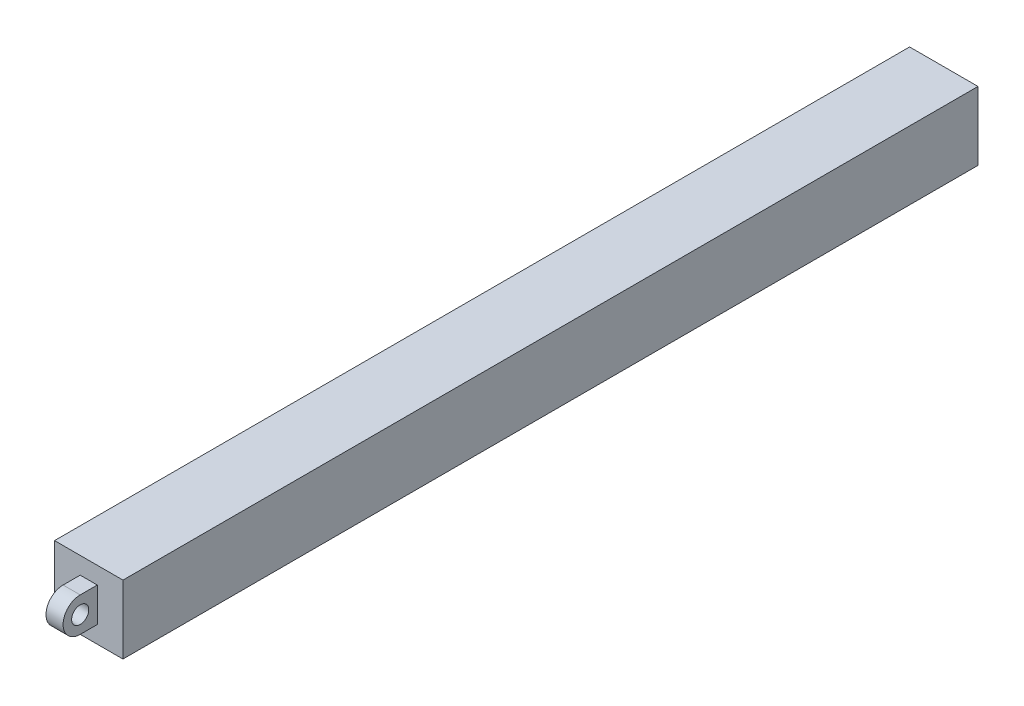
ISO-10303-21;
HEADER;
FILE_DESCRIPTION(('STEP AP214'),'2;1');
FILE_NAME('part.step','',(''),(''),'','','');
FILE_SCHEMA(('AUTOMOTIVE_DESIGN { 1 0 10303 214 1 1 1 1 }'));
ENDSEC;
DATA;
#1=APPLICATION_CONTEXT('core data for automotive mechanical design processes');
#2=APPLICATION_PROTOCOL_DEFINITION('international standard','automotive_design',2000,#1);
#3=PRODUCT_CONTEXT('',#1,'mechanical');
#4=PRODUCT('Part','Part','',(#3));
#5=PRODUCT_RELATED_PRODUCT_CATEGORY('part','',(#4));
#6=PRODUCT_DEFINITION_FORMATION('','',#4);
#7=PRODUCT_DEFINITION_CONTEXT('part definition',#1,'design');
#8=PRODUCT_DEFINITION('design','',#6,#7);
#9=PRODUCT_DEFINITION_SHAPE('','',#8);
#10=(LENGTH_UNIT() NAMED_UNIT(*) SI_UNIT(.MILLI.,.METRE.));
#11=(NAMED_UNIT(*) PLANE_ANGLE_UNIT() SI_UNIT($,.RADIAN.));
#12=(NAMED_UNIT(*) SI_UNIT($,.STERADIAN.) SOLID_ANGLE_UNIT());
#13=UNCERTAINTY_MEASURE_WITH_UNIT(LENGTH_MEASURE(1.E-05),#10,'distance_accuracy_value','');
#14=(GEOMETRIC_REPRESENTATION_CONTEXT(3) GLOBAL_UNCERTAINTY_ASSIGNED_CONTEXT((#13)) GLOBAL_UNIT_ASSIGNED_CONTEXT((#10,
#11,#12)) REPRESENTATION_CONTEXT('',''));
#15=CARTESIAN_POINT('',(0.,0.,0.));
#16=DIRECTION('',(0.,0.,1.));
#17=DIRECTION('',(1.,0.,0.));
#18=AXIS2_PLACEMENT_3D('',#15,#16,#17);
#19=CARTESIAN_POINT('',(5.,5.,62.5));
#20=DIRECTION('',(0.,0.,-1.));
#21=DIRECTION('',(-1.,0.,0.));
#22=AXIS2_PLACEMENT_3D('',#19,#20,#21);
#23=PLANE('',#22);
#24=DIRECTION('',(0.,-1.,0.));
#25=VECTOR('',#24,1.);
#26=CARTESIAN_POINT('',(-5.,5.,62.5));
#27=LINE('',#26,#25);
#28=CARTESIAN_POINT('',(-5.,5.,62.5));
#29=VERTEX_POINT('',#28);
#30=CARTESIAN_POINT('',(-5.,-5.,62.5));
#31=VERTEX_POINT('',#30);
#32=EDGE_CURVE('E117',#29,#31,#27,.T.);
#33=ORIENTED_EDGE('',*,*,#32,.T.);
#34=DIRECTION('',(-1.,0.,0.));
#35=VECTOR('',#34,1.);
#36=CARTESIAN_POINT('',(5.,-5.,62.5));
#37=LINE('',#36,#35);
#38=CARTESIAN_POINT('',(5.,-5.,62.5));
#39=VERTEX_POINT('',#38);
#40=EDGE_CURVE('E11',#39,#31,#37,.T.);
#41=ORIENTED_EDGE('',*,*,#40,.F.);
#42=DIRECTION('',(0.,-1.,0.));
#43=VECTOR('',#42,1.);
#44=CARTESIAN_POINT('',(5.,5.,62.5));
#45=LINE('',#44,#43);
#46=CARTESIAN_POINT('',(5.,5.,62.5));
#47=VERTEX_POINT('',#46);
#48=EDGE_CURVE('E126',#47,#39,#45,.T.);
#49=ORIENTED_EDGE('',*,*,#48,.F.);
#50=DIRECTION('',(-1.,0.,0.));
#51=VECTOR('',#50,1.);
#52=CARTESIAN_POINT('',(5.,5.,62.5));
#53=LINE('',#52,#51);
#54=EDGE_CURVE('E135',#47,#29,#53,.T.);
#55=ORIENTED_EDGE('',*,*,#54,.T.);
#56=EDGE_LOOP('',(#33,#41,#49,#55));
#57=FACE_BOUND('',#56,.T.);
#58=DIRECTION('',(-1.,0.,0.));
#59=VECTOR('',#58,1.);
#60=CARTESIAN_POINT('',(1.25,-2.5,62.5));
#61=LINE('',#60,#59);
#62=CARTESIAN_POINT('',(1.25,-2.5,62.5));
#63=VERTEX_POINT('',#62);
#64=CARTESIAN_POINT('',(-1.25,-2.5,62.5));
#65=VERTEX_POINT('',#64);
#66=EDGE_CURVE('E52',#63,#65,#61,.T.);
#67=ORIENTED_EDGE('',*,*,#66,.T.);
#68=DIRECTION('',(0.,1.,0.));
#69=VECTOR('',#68,1.);
#70=CARTESIAN_POINT('',(-1.25,2.5,62.5));
#71=LINE('',#70,#69);
#72=CARTESIAN_POINT('',(-1.25,2.5,62.5));
#73=VERTEX_POINT('',#72);
#74=EDGE_CURVE('E216',#65,#73,#71,.T.);
#75=ORIENTED_EDGE('',*,*,#74,.T.);
#76=DIRECTION('',(-1.,0.,0.));
#77=VECTOR('',#76,1.);
#78=CARTESIAN_POINT('',(1.25,2.5,62.5));
#79=LINE('',#78,#77);
#80=CARTESIAN_POINT('',(1.25,2.5,62.5));
#81=VERTEX_POINT('',#80);
#82=EDGE_CURVE('E122',#81,#73,#79,.T.);
#83=ORIENTED_EDGE('',*,*,#82,.F.);
#84=DIRECTION('',(0.,1.,0.));
#85=VECTOR('',#84,1.);
#86=CARTESIAN_POINT('',(1.25,2.5,62.5));
#87=LINE('',#86,#85);
#88=EDGE_CURVE('E47',#63,#81,#87,.T.);
#89=ORIENTED_EDGE('',*,*,#88,.F.);
#90=EDGE_LOOP('',(#67,#75,#83,#89));
#91=FACE_BOUND('',#90,.T.);
#92=ADVANCED_FACE('F33',(#57,#91),#23,.F.);
#93=CARTESIAN_POINT('',(5.,-5.,62.5));
#94=DIRECTION('',(0.,1.,0.));
#95=DIRECTION('',(0.,0.,1.));
#96=AXIS2_PLACEMENT_3D('',#93,#94,#95);
#97=PLANE('',#96);
#98=DIRECTION('',(0.,0.,-1.));
#99=VECTOR('',#98,1.);
#100=CARTESIAN_POINT('',(-5.,-5.,62.5));
#101=LINE('',#100,#99);
#102=CARTESIAN_POINT('',(-5.,-5.,-62.5));
#103=VERTEX_POINT('',#102);
#104=EDGE_CURVE('E120',#31,#103,#101,.T.);
#105=ORIENTED_EDGE('',*,*,#104,.T.);
#106=DIRECTION('',(-1.,0.,0.));
#107=VECTOR('',#106,1.);
#108=CARTESIAN_POINT('',(5.,-5.,-62.5));
#109=LINE('',#108,#107);
#110=CARTESIAN_POINT('',(5.,-5.,-62.5));
#111=VERTEX_POINT('',#110);
#112=EDGE_CURVE('E40',#111,#103,#109,.T.);
#113=ORIENTED_EDGE('',*,*,#112,.F.);
#114=DIRECTION('',(0.,0.,-1.));
#115=VECTOR('',#114,1.);
#116=CARTESIAN_POINT('',(5.,-5.,62.5));
#117=LINE('',#116,#115);
#118=EDGE_CURVE('E129',#39,#111,#117,.T.);
#119=ORIENTED_EDGE('',*,*,#118,.F.);
#120=ORIENTED_EDGE('',*,*,#40,.T.);
#121=EDGE_LOOP('',(#105,#113,#119,#120));
#122=FACE_BOUND('',#121,.T.);
#123=ADVANCED_FACE('F166',(#122),#97,.F.);
#124=CARTESIAN_POINT('',(5.,5.,-62.5));
#125=DIRECTION('',(0.,0.,1.));
#126=DIRECTION('',(1.,0.,0.));
#127=AXIS2_PLACEMENT_3D('',#124,#125,#126);
#128=PLANE('',#127);
#129=DIRECTION('',(0.,1.,0.));
#130=VECTOR('',#129,1.);
#131=CARTESIAN_POINT('',(-5.,5.,-62.5));
#132=LINE('',#131,#130);
#133=CARTESIAN_POINT('',(-5.,5.,-62.5));
#134=VERTEX_POINT('',#133);
#135=EDGE_CURVE('E138',#103,#134,#132,.T.);
#136=ORIENTED_EDGE('',*,*,#135,.T.);
#137=DIRECTION('',(-1.,0.,0.));
#138=VECTOR('',#137,1.);
#139=CARTESIAN_POINT('',(5.,5.,-62.5));
#140=LINE('',#139,#138);
#141=CARTESIAN_POINT('',(5.,5.,-62.5));
#142=VERTEX_POINT('',#141);
#143=EDGE_CURVE('E143',#142,#134,#140,.T.);
#144=ORIENTED_EDGE('',*,*,#143,.F.);
#145=DIRECTION('',(0.,1.,0.));
#146=VECTOR('',#145,1.);
#147=CARTESIAN_POINT('',(5.,5.,-62.5));
#148=LINE('',#147,#146);
#149=EDGE_CURVE('E132',#111,#142,#148,.T.);
#150=ORIENTED_EDGE('',*,*,#149,.F.);
#151=ORIENTED_EDGE('',*,*,#112,.T.);
#152=EDGE_LOOP('',(#136,#144,#150,#151));
#153=FACE_BOUND('',#152,.T.);
#154=ADVANCED_FACE('F150',(#153),#128,.F.);
#155=CARTESIAN_POINT('',(5.,5.,62.5));
#156=DIRECTION('',(0.,-1.,0.));
#157=DIRECTION('',(0.,0.,-1.));
#158=AXIS2_PLACEMENT_3D('',#155,#156,#157);
#159=PLANE('',#158);
#160=DIRECTION('',(0.,0.,1.));
#161=VECTOR('',#160,1.);
#162=CARTESIAN_POINT('',(-5.,5.,62.5));
#163=LINE('',#162,#161);
#164=EDGE_CURVE('E130',#134,#29,#163,.T.);
#165=ORIENTED_EDGE('',*,*,#164,.T.);
#166=ORIENTED_EDGE('',*,*,#54,.F.);
#167=DIRECTION('',(0.,0.,1.));
#168=VECTOR('',#167,1.);
#169=CARTESIAN_POINT('',(5.,5.,62.5));
#170=LINE('',#169,#168);
#171=EDGE_CURVE('E134',#142,#47,#170,.T.);
#172=ORIENTED_EDGE('',*,*,#171,.F.);
#173=ORIENTED_EDGE('',*,*,#143,.T.);
#174=EDGE_LOOP('',(#165,#166,#172,#173));
#175=FACE_BOUND('',#174,.T.);
#176=ADVANCED_FACE('F159',(#175),#159,.F.);
#177=CARTESIAN_POINT('',(5.,0.,0.));
#178=DIRECTION('',(1.,0.,0.));
#179=DIRECTION('',(0.,0.,-1.));
#180=AXIS2_PLACEMENT_3D('',#177,#178,#179);
#181=PLANE('',#180);
#182=ORIENTED_EDGE('',*,*,#48,.T.);
#183=ORIENTED_EDGE('',*,*,#118,.T.);
#184=ORIENTED_EDGE('',*,*,#149,.T.);
#185=ORIENTED_EDGE('',*,*,#171,.T.);
#186=EDGE_LOOP('',(#182,#183,#184,#185));
#187=FACE_BOUND('',#186,.T.);
#188=ADVANCED_FACE('F165',(#187),#181,.T.);
#189=CARTESIAN_POINT('',(-5.,0.,0.));
#190=DIRECTION('',(1.,0.,0.));
#191=DIRECTION('',(0.,0.,-1.));
#192=AXIS2_PLACEMENT_3D('',#189,#190,#191);
#193=PLANE('',#192);
#194=ORIENTED_EDGE('',*,*,#32,.F.);
#195=ORIENTED_EDGE('',*,*,#164,.F.);
#196=ORIENTED_EDGE('',*,*,#135,.F.);
#197=ORIENTED_EDGE('',*,*,#104,.F.);
#198=EDGE_LOOP('',(#194,#195,#196,#197));
#199=FACE_BOUND('',#198,.T.);
#200=ADVANCED_FACE('F156',(#199),#193,.F.);
#201=CARTESIAN_POINT('',(1.25,0.,65.));
#202=DIRECTION('',(1.,0.,0.));
#203=DIRECTION('',(0.,0.,-1.));
#204=AXIS2_PLACEMENT_3D('',#201,#202,#203);
#205=PLANE('',#204);
#206=CARTESIAN_POINT('',(1.25,0.,65.));
#207=DIRECTION('',(1.,0.,0.));
#208=DIRECTION('',(0.,0.,-1.));
#209=AXIS2_PLACEMENT_3D('',#206,#207,#208);
#210=CIRCLE('',#209,2.5);
#211=CARTESIAN_POINT('',(1.25,2.5,65.));
#212=VERTEX_POINT('',#211);
#213=CARTESIAN_POINT('',(1.25,-2.5,65.));
#214=VERTEX_POINT('',#213);
#215=EDGE_CURVE('E102',#212,#214,#210,.T.);
#216=ORIENTED_EDGE('',*,*,#215,.T.);
#217=DIRECTION('',(0.,0.,-1.));
#218=VECTOR('',#217,1.);
#219=CARTESIAN_POINT('',(1.25,-2.5,65.));
#220=LINE('',#219,#218);
#221=EDGE_CURVE('E95',#214,#63,#220,.T.);
#222=ORIENTED_EDGE('',*,*,#221,.T.);
#223=ORIENTED_EDGE('',*,*,#88,.T.);
#224=DIRECTION('',(0.,0.,1.));
#225=VECTOR('',#224,1.);
#226=CARTESIAN_POINT('',(1.25,2.5,65.));
#227=LINE('',#226,#225);
#228=EDGE_CURVE('E108',#81,#212,#227,.T.);
#229=ORIENTED_EDGE('',*,*,#228,.T.);
#230=EDGE_LOOP('',(#216,#222,#223,#229));
#231=FACE_BOUND('',#230,.T.);
#232=CARTESIAN_POINT('',(1.25,0.,65.));
#233=DIRECTION('',(1.,0.,0.));
#234=DIRECTION('',(0.,0.,-1.));
#235=AXIS2_PLACEMENT_3D('',#232,#233,#234);
#236=CIRCLE('',#235,1.25);
#237=CARTESIAN_POINT('',(1.25,0.,63.75));
#238=VERTEX_POINT('',#237);
#239=EDGE_CURVE('E202',#238,#238,#236,.T.);
#240=ORIENTED_EDGE('',*,*,#239,.F.);
#241=EDGE_LOOP('',(#240));
#242=FACE_BOUND('',#241,.T.);
#243=ADVANCED_FACE('F105',(#231,#242),#205,.T.);
#244=CARTESIAN_POINT('',(-1.25,0.,65.));
#245=DIRECTION('',(1.,0.,0.));
#246=DIRECTION('',(0.,0.,-1.));
#247=AXIS2_PLACEMENT_3D('',#244,#245,#246);
#248=PLANE('',#247);
#249=CARTESIAN_POINT('',(-1.25,0.,65.));
#250=DIRECTION('',(1.,0.,0.));
#251=DIRECTION('',(0.,0.,-1.));
#252=AXIS2_PLACEMENT_3D('',#249,#250,#251);
#253=CIRCLE('',#252,2.5);
#254=CARTESIAN_POINT('',(-1.25,2.5,65.));
#255=VERTEX_POINT('',#254);
#256=CARTESIAN_POINT('',(-1.25,-2.5,65.));
#257=VERTEX_POINT('',#256);
#258=EDGE_CURVE('E116',#255,#257,#253,.T.);
#259=ORIENTED_EDGE('',*,*,#258,.F.);
#260=DIRECTION('',(0.,0.,1.));
#261=VECTOR('',#260,1.);
#262=CARTESIAN_POINT('',(-1.25,2.5,65.));
#263=LINE('',#262,#261);
#264=EDGE_CURVE('E112',#73,#255,#263,.T.);
#265=ORIENTED_EDGE('',*,*,#264,.F.);
#266=ORIENTED_EDGE('',*,*,#74,.F.);
#267=DIRECTION('',(0.,0.,-1.));
#268=VECTOR('',#267,1.);
#269=CARTESIAN_POINT('',(-1.25,-2.5,65.));
#270=LINE('',#269,#268);
#271=EDGE_CURVE('E214',#257,#65,#270,.T.);
#272=ORIENTED_EDGE('',*,*,#271,.F.);
#273=EDGE_LOOP('',(#259,#265,#266,#272));
#274=FACE_BOUND('',#273,.T.);
#275=CARTESIAN_POINT('',(-1.25,0.,65.));
#276=DIRECTION('',(1.,0.,0.));
#277=DIRECTION('',(0.,0.,-1.));
#278=AXIS2_PLACEMENT_3D('',#275,#276,#277);
#279=CIRCLE('',#278,1.25);
#280=CARTESIAN_POINT('',(-1.25,0.,63.75));
#281=VERTEX_POINT('',#280);
#282=EDGE_CURVE('E205',#281,#281,#279,.T.);
#283=ORIENTED_EDGE('',*,*,#282,.T.);
#284=EDGE_LOOP('',(#283));
#285=FACE_BOUND('',#284,.T.);
#286=ADVANCED_FACE('F182',(#274,#285),#248,.F.);
#287=CARTESIAN_POINT('',(1.25,0.,65.));
#288=DIRECTION('',(-1.,0.,0.));
#289=DIRECTION('',(0.,0.,1.));
#290=AXIS2_PLACEMENT_3D('',#287,#288,#289);
#291=CYLINDRICAL_SURFACE('',#290,2.5);
#292=ORIENTED_EDGE('',*,*,#258,.T.);
#293=DIRECTION('',(-1.,0.,0.));
#294=VECTOR('',#293,1.);
#295=CARTESIAN_POINT('',(1.25,-2.5,65.));
#296=LINE('',#295,#294);
#297=EDGE_CURVE('E99',#214,#257,#296,.T.);
#298=ORIENTED_EDGE('',*,*,#297,.F.);
#299=ORIENTED_EDGE('',*,*,#215,.F.);
#300=DIRECTION('',(-1.,0.,0.));
#301=VECTOR('',#300,1.);
#302=CARTESIAN_POINT('',(1.25,2.5,65.));
#303=LINE('',#302,#301);
#304=EDGE_CURVE('E212',#212,#255,#303,.T.);
#305=ORIENTED_EDGE('',*,*,#304,.T.);
#306=EDGE_LOOP('',(#292,#298,#299,#305));
#307=FACE_BOUND('',#306,.T.);
#308=ADVANCED_FACE('F114',(#307),#291,.T.);
#309=CARTESIAN_POINT('',(1.25,-2.5,65.));
#310=DIRECTION('',(0.,1.,0.));
#311=DIRECTION('',(0.,0.,1.));
#312=AXIS2_PLACEMENT_3D('',#309,#310,#311);
#313=PLANE('',#312);
#314=ORIENTED_EDGE('',*,*,#271,.T.);
#315=ORIENTED_EDGE('',*,*,#66,.F.);
#316=ORIENTED_EDGE('',*,*,#221,.F.);
#317=ORIENTED_EDGE('',*,*,#297,.T.);
#318=EDGE_LOOP('',(#314,#315,#316,#317));
#319=FACE_BOUND('',#318,.T.);
#320=ADVANCED_FACE('F97',(#319),#313,.F.);
#321=CARTESIAN_POINT('',(1.25,2.5,65.));
#322=DIRECTION('',(0.,-1.,0.));
#323=DIRECTION('',(0.,0.,-1.));
#324=AXIS2_PLACEMENT_3D('',#321,#322,#323);
#325=PLANE('',#324);
#326=ORIENTED_EDGE('',*,*,#264,.T.);
#327=ORIENTED_EDGE('',*,*,#304,.F.);
#328=ORIENTED_EDGE('',*,*,#228,.F.);
#329=ORIENTED_EDGE('',*,*,#82,.T.);
#330=EDGE_LOOP('',(#326,#327,#328,#329));
#331=FACE_BOUND('',#330,.T.);
#332=ADVANCED_FACE('F185',(#331),#325,.F.);
#333=CARTESIAN_POINT('',(1.25,0.,65.));
#334=DIRECTION('',(-1.,0.,0.));
#335=DIRECTION('',(0.,0.,1.));
#336=AXIS2_PLACEMENT_3D('',#333,#334,#335);
#337=CYLINDRICAL_SURFACE('',#336,1.25);
#338=ORIENTED_EDGE('',*,*,#239,.T.);
#339=EDGE_LOOP('',(#338));
#340=FACE_BOUND('',#339,.T.);
#341=ORIENTED_EDGE('',*,*,#282,.F.);
#342=EDGE_LOOP('',(#341));
#343=FACE_BOUND('',#342,.T.);
#344=ADVANCED_FACE('F188',(#340,#343),#337,.F.);
#345=CLOSED_SHELL('',(#92,#123,#154,#176,#188,#200,#243,#286,#308,#320,#332,#344));
#346=MANIFOLD_SOLID_BREP('B2',#345);
#347=ADVANCED_BREP_SHAPE_REPRESENTATION('',(#18,#346),#14);
#348=SHAPE_DEFINITION_REPRESENTATION(#9,#347);
ENDSEC;
END-ISO-10303-21;
